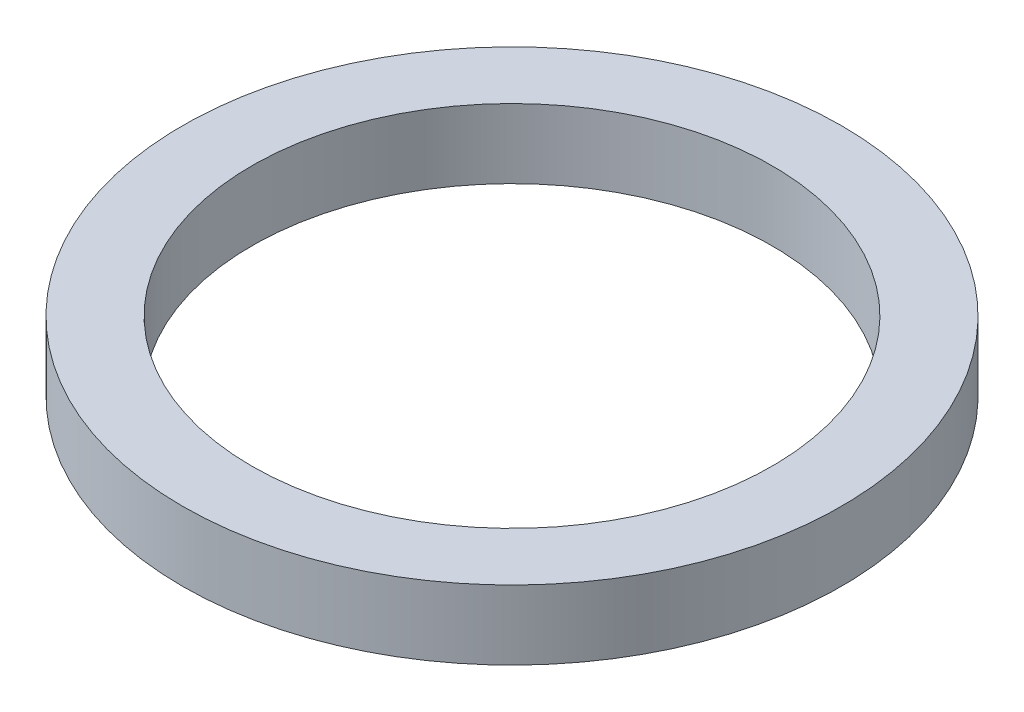
ISO-10303-21;
HEADER;
FILE_DESCRIPTION(('STEP AP214'),'2;1');
FILE_NAME('part.step','',(''),(''),'','','');
FILE_SCHEMA(('AUTOMOTIVE_DESIGN { 1 0 10303 214 1 1 1 1 }'));
ENDSEC;
DATA;
#1=APPLICATION_CONTEXT('core data for automotive mechanical design processes');
#2=APPLICATION_PROTOCOL_DEFINITION('international standard','automotive_design',2000,#1);
#3=PRODUCT_CONTEXT('',#1,'mechanical');
#4=PRODUCT('Part','Part','',(#3));
#5=PRODUCT_RELATED_PRODUCT_CATEGORY('part','',(#4));
#6=PRODUCT_DEFINITION_FORMATION('','',#4);
#7=PRODUCT_DEFINITION_CONTEXT('part definition',#1,'design');
#8=PRODUCT_DEFINITION('design','',#6,#7);
#9=PRODUCT_DEFINITION_SHAPE('','',#8);
#10=(LENGTH_UNIT() NAMED_UNIT(*) SI_UNIT(.MILLI.,.METRE.));
#11=(NAMED_UNIT(*) PLANE_ANGLE_UNIT() SI_UNIT($,.RADIAN.));
#12=(NAMED_UNIT(*) SI_UNIT($,.STERADIAN.) SOLID_ANGLE_UNIT());
#13=UNCERTAINTY_MEASURE_WITH_UNIT(LENGTH_MEASURE(1.E-05),#10,'distance_accuracy_value','');
#14=(GEOMETRIC_REPRESENTATION_CONTEXT(3) GLOBAL_UNCERTAINTY_ASSIGNED_CONTEXT((#13)) GLOBAL_UNIT_ASSIGNED_CONTEXT((#10,
#11,#12)) REPRESENTATION_CONTEXT('',''));
#15=CARTESIAN_POINT('',(0.,0.,0.));
#16=DIRECTION('',(0.,0.,1.));
#17=DIRECTION('',(1.,0.,0.));
#18=AXIS2_PLACEMENT_3D('',#15,#16,#17);
#19=CARTESIAN_POINT('',(0.,10.,0.));
#20=DIRECTION('',(0.,1.,0.));
#21=DIRECTION('',(0.,0.,1.));
#22=AXIS2_PLACEMENT_3D('',#19,#20,#21);
#23=PLANE('',#22);
#24=CARTESIAN_POINT('',(0.,10.,0.));
#25=DIRECTION('',(0.,1.,0.));
#26=DIRECTION('',(0.,0.,1.));
#27=AXIS2_PLACEMENT_3D('',#24,#25,#26);
#28=CIRCLE('',#27,47.5);
#29=CARTESIAN_POINT('',(0.,10.,47.5));
#30=VERTEX_POINT('',#29);
#31=EDGE_CURVE('E10',#30,#30,#28,.T.);
#32=ORIENTED_EDGE('',*,*,#31,.T.);
#33=EDGE_LOOP('',(#32));
#34=FACE_BOUND('',#33,.T.);
#35=CARTESIAN_POINT('',(0.,10.,0.));
#36=DIRECTION('',(0.,1.,0.));
#37=DIRECTION('',(0.,0.,1.));
#38=AXIS2_PLACEMENT_3D('',#35,#36,#37);
#39=CIRCLE('',#38,37.5);
#40=CARTESIAN_POINT('',(0.,10.,37.5));
#41=VERTEX_POINT('',#40);
#42=EDGE_CURVE('E43',#41,#41,#39,.T.);
#43=ORIENTED_EDGE('',*,*,#42,.F.);
#44=EDGE_LOOP('',(#43));
#45=FACE_BOUND('',#44,.T.);
#46=ADVANCED_FACE('F32',(#34,#45),#23,.T.);
#47=CARTESIAN_POINT('',(0.,0.,0.));
#48=DIRECTION('',(0.,1.,0.));
#49=DIRECTION('',(0.,0.,1.));
#50=AXIS2_PLACEMENT_3D('',#47,#48,#49);
#51=PLANE('',#50);
#52=CARTESIAN_POINT('',(0.,0.,0.));
#53=DIRECTION('',(0.,1.,0.));
#54=DIRECTION('',(0.,0.,1.));
#55=AXIS2_PLACEMENT_3D('',#52,#53,#54);
#56=CIRCLE('',#55,47.5);
#57=CARTESIAN_POINT('',(0.,0.,47.5));
#58=VERTEX_POINT('',#57);
#59=EDGE_CURVE('E36',#58,#58,#56,.T.);
#60=ORIENTED_EDGE('',*,*,#59,.F.);
#61=EDGE_LOOP('',(#60));
#62=FACE_BOUND('',#61,.T.);
#63=CARTESIAN_POINT('',(0.,0.,0.));
#64=DIRECTION('',(0.,1.,0.));
#65=DIRECTION('',(0.,0.,1.));
#66=AXIS2_PLACEMENT_3D('',#63,#64,#65);
#67=CIRCLE('',#66,37.5);
#68=CARTESIAN_POINT('',(0.,0.,37.5));
#69=VERTEX_POINT('',#68);
#70=EDGE_CURVE('E45',#69,#69,#67,.T.);
#71=ORIENTED_EDGE('',*,*,#70,.T.);
#72=EDGE_LOOP('',(#71));
#73=FACE_BOUND('',#72,.T.);
#74=ADVANCED_FACE('F55',(#62,#73),#51,.F.);
#75=CARTESIAN_POINT('',(0.,10.,0.));
#76=DIRECTION('',(0.,-1.,0.));
#77=DIRECTION('',(0.,0.,-1.));
#78=AXIS2_PLACEMENT_3D('',#75,#76,#77);
#79=CYLINDRICAL_SURFACE('',#78,47.5);
#80=ORIENTED_EDGE('',*,*,#31,.F.);
#81=EDGE_LOOP('',(#80));
#82=FACE_BOUND('',#81,.T.);
#83=ORIENTED_EDGE('',*,*,#59,.T.);
#84=EDGE_LOOP('',(#83));
#85=FACE_BOUND('',#84,.T.);
#86=ADVANCED_FACE('F34',(#82,#85),#79,.T.);
#87=CARTESIAN_POINT('',(0.,10.,0.));
#88=DIRECTION('',(0.,-1.,0.));
#89=DIRECTION('',(0.,0.,-1.));
#90=AXIS2_PLACEMENT_3D('',#87,#88,#89);
#91=CYLINDRICAL_SURFACE('',#90,37.5);
#92=ORIENTED_EDGE('',*,*,#42,.T.);
#93=EDGE_LOOP('',(#92));
#94=FACE_BOUND('',#93,.T.);
#95=ORIENTED_EDGE('',*,*,#70,.F.);
#96=EDGE_LOOP('',(#95));
#97=FACE_BOUND('',#96,.T.);
#98=ADVANCED_FACE('F51',(#94,#97),#91,.F.);
#99=CLOSED_SHELL('',(#46,#74,#86,#98));
#100=MANIFOLD_SOLID_BREP('B2',#99);
#101=ADVANCED_BREP_SHAPE_REPRESENTATION('',(#18,#100),#14);
#102=SHAPE_DEFINITION_REPRESENTATION(#9,#101);
ENDSEC;
END-ISO-10303-21;
